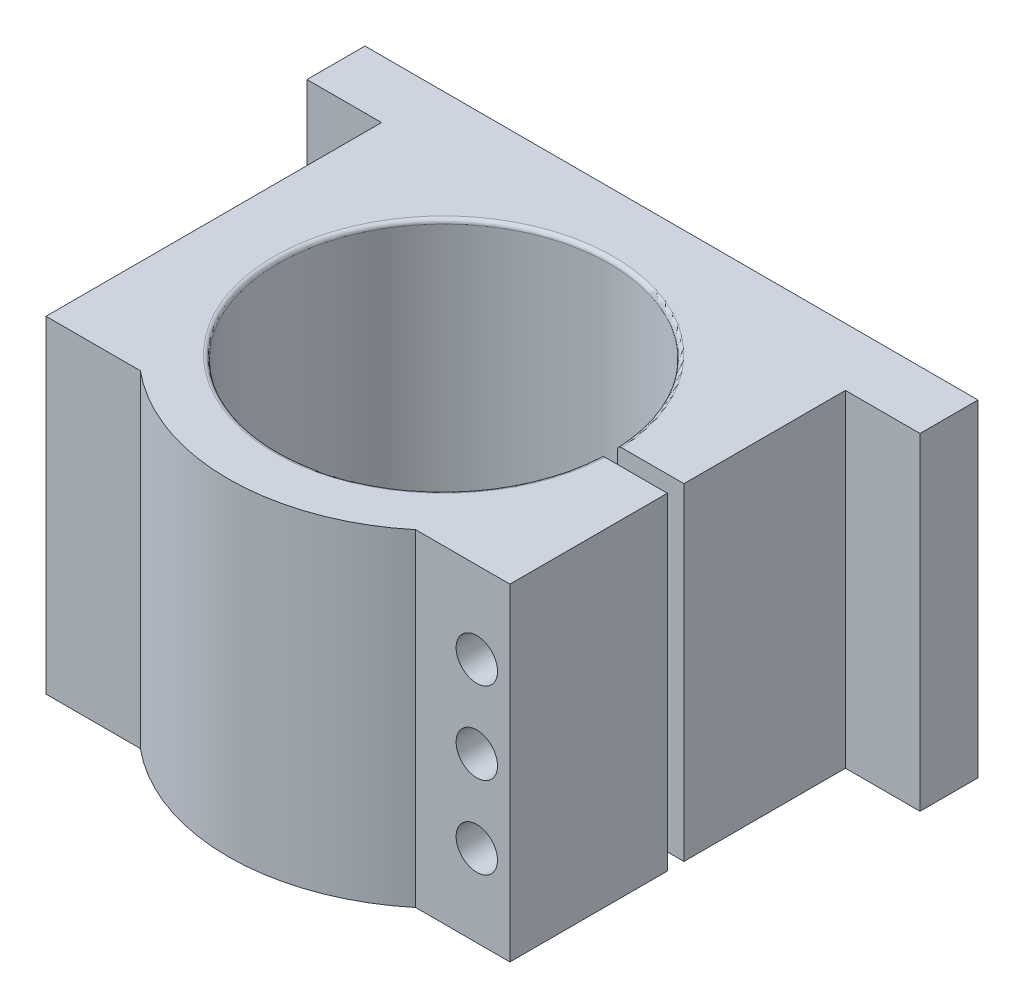
ISO-10303-21;
HEADER;
FILE_DESCRIPTION(('STEP AP214'),'2;1');
FILE_NAME('part.step','',(''),(''),'','','');
FILE_SCHEMA(('AUTOMOTIVE_DESIGN { 1 0 10303 214 1 1 1 1 }'));
ENDSEC;
DATA;
#1=APPLICATION_CONTEXT('core data for automotive mechanical design processes');
#2=APPLICATION_PROTOCOL_DEFINITION('international standard','automotive_design',2000,#1);
#3=PRODUCT_CONTEXT('',#1,'mechanical');
#4=PRODUCT('Part','Part','',(#3));
#5=PRODUCT_RELATED_PRODUCT_CATEGORY('part','',(#4));
#6=PRODUCT_DEFINITION_FORMATION('','',#4);
#7=PRODUCT_DEFINITION_CONTEXT('part definition',#1,'design');
#8=PRODUCT_DEFINITION('design','',#6,#7);
#9=PRODUCT_DEFINITION_SHAPE('','',#8);
#10=(LENGTH_UNIT() NAMED_UNIT(*) SI_UNIT(.MILLI.,.METRE.));
#11=(NAMED_UNIT(*) PLANE_ANGLE_UNIT() SI_UNIT($,.RADIAN.));
#12=(NAMED_UNIT(*) SI_UNIT($,.STERADIAN.) SOLID_ANGLE_UNIT());
#13=UNCERTAINTY_MEASURE_WITH_UNIT(LENGTH_MEASURE(1.E-05),#10,'distance_accuracy_value','');
#14=(GEOMETRIC_REPRESENTATION_CONTEXT(3) GLOBAL_UNCERTAINTY_ASSIGNED_CONTEXT((#13)) GLOBAL_UNIT_ASSIGNED_CONTEXT((#10,
#11,#12)) REPRESENTATION_CONTEXT('',''));
#15=CARTESIAN_POINT('',(0.,0.,0.));
#16=DIRECTION('',(0.,0.,1.));
#17=DIRECTION('',(1.,0.,0.));
#18=AXIS2_PLACEMENT_3D('',#15,#16,#17);
#19=CARTESIAN_POINT('',(48.,-19.75,35.));
#20=DIRECTION('',(0.,0.,1.));
#21=DIRECTION('',(1.,0.,0.));
#22=AXIS2_PLACEMENT_3D('',#19,#20,#21);
#23=CYLINDRICAL_SURFACE('',#22,3.);
#24=CARTESIAN_POINT('',(48.,-19.75,57.));
#25=DIRECTION('',(0.,0.,1.));
#26=DIRECTION('',(1.,0.,0.));
#27=AXIS2_PLACEMENT_3D('',#24,#25,#26);
#28=CIRCLE('',#27,3.);
#29=CARTESIAN_POINT('',(51.,-19.75,57.));
#30=VERTEX_POINT('',#29);
#31=EDGE_CURVE('E359',#30,#30,#28,.T.);
#32=ORIENTED_EDGE('',*,*,#31,.F.);
#33=EDGE_LOOP('',(#32));
#34=FACE_BOUND('',#33,.T.);
#35=CARTESIAN_POINT('',(48.,-19.75,85.));
#36=DIRECTION('',(0.,0.,1.));
#37=DIRECTION('',(1.,0.,0.));
#38=AXIS2_PLACEMENT_3D('',#35,#36,#37);
#39=CIRCLE('',#38,3.);
#40=CARTESIAN_POINT('',(51.,-19.75,85.));
#41=VERTEX_POINT('',#40);
#42=EDGE_CURVE('E238',#41,#41,#39,.F.);
#43=ORIENTED_EDGE('',*,*,#42,.F.);
#44=EDGE_LOOP('',(#43));
#45=FACE_BOUND('',#44,.T.);
#46=ADVANCED_FACE('F57',(#34,#45),#23,.F.);
#47=CARTESIAN_POINT('',(48.,0.,35.));
#48=DIRECTION('',(0.,0.,1.));
#49=DIRECTION('',(1.,0.,0.));
#50=AXIS2_PLACEMENT_3D('',#47,#48,#49);
#51=CYLINDRICAL_SURFACE('',#50,3.);
#52=CARTESIAN_POINT('',(48.,0.,57.));
#53=DIRECTION('',(0.,0.,1.));
#54=DIRECTION('',(1.,0.,0.));
#55=AXIS2_PLACEMENT_3D('',#52,#53,#54);
#56=CIRCLE('',#55,3.);
#57=CARTESIAN_POINT('',(51.,0.,57.));
#58=VERTEX_POINT('',#57);
#59=EDGE_CURVE('E362',#58,#58,#56,.T.);
#60=ORIENTED_EDGE('',*,*,#59,.F.);
#61=EDGE_LOOP('',(#60));
#62=FACE_BOUND('',#61,.T.);
#63=CARTESIAN_POINT('',(48.,0.,85.));
#64=DIRECTION('',(0.,0.,1.));
#65=DIRECTION('',(1.,0.,0.));
#66=AXIS2_PLACEMENT_3D('',#63,#64,#65);
#67=CIRCLE('',#66,3.);
#68=CARTESIAN_POINT('',(51.,0.,85.));
#69=VERTEX_POINT('',#68);
#70=EDGE_CURVE('E502',#69,#69,#67,.F.);
#71=ORIENTED_EDGE('',*,*,#70,.F.);
#72=EDGE_LOOP('',(#71));
#73=FACE_BOUND('',#72,.T.);
#74=ADVANCED_FACE('F325',(#62,#73),#51,.F.);
#75=CARTESIAN_POINT('',(48.,19.75,35.));
#76=DIRECTION('',(0.,0.,1.));
#77=DIRECTION('',(1.,0.,0.));
#78=AXIS2_PLACEMENT_3D('',#75,#76,#77);
#79=CYLINDRICAL_SURFACE('',#78,3.);
#80=CARTESIAN_POINT('',(48.,19.75,57.));
#81=DIRECTION('',(0.,0.,1.));
#82=DIRECTION('',(1.,0.,0.));
#83=AXIS2_PLACEMENT_3D('',#80,#81,#82);
#84=CIRCLE('',#83,3.);
#85=CARTESIAN_POINT('',(51.,19.75,57.));
#86=VERTEX_POINT('',#85);
#87=EDGE_CURVE('E202',#86,#86,#84,.T.);
#88=ORIENTED_EDGE('',*,*,#87,.F.);
#89=EDGE_LOOP('',(#88));
#90=FACE_BOUND('',#89,.T.);
#91=CARTESIAN_POINT('',(48.,19.75,85.));
#92=DIRECTION('',(0.,0.,1.));
#93=DIRECTION('',(1.,0.,0.));
#94=AXIS2_PLACEMENT_3D('',#91,#92,#93);
#95=CIRCLE('',#94,3.);
#96=CARTESIAN_POINT('',(51.,19.75,85.));
#97=VERTEX_POINT('',#96);
#98=EDGE_CURVE('E504',#97,#97,#95,.F.);
#99=ORIENTED_EDGE('',*,*,#98,.F.);
#100=EDGE_LOOP('',(#99));
#101=FACE_BOUND('',#100,.T.);
#102=ADVANCED_FACE('F332',(#90,#101),#79,.F.);
#103=CARTESIAN_POINT('',(56.,-39.5,107.));
#104=DIRECTION('',(-1.,0.,0.));
#105=DIRECTION('',(0.,0.,1.));
#106=AXIS2_PLACEMENT_3D('',#103,#104,#105);
#107=PLANE('',#106);
#108=DIRECTION('',(0.,0.,-1.));
#109=VECTOR('',#108,1.);
#110=CARTESIAN_POINT('',(56.,-39.5,107.));
#111=LINE('',#110,#109);
#112=CARTESIAN_POINT('',(56.,-39.5,95.));
#113=VERTEX_POINT('',#112);
#114=CARTESIAN_POINT('',(56.,-39.5,57.));
#115=VERTEX_POINT('',#114);
#116=EDGE_CURVE('E214',#113,#115,#111,.T.);
#117=ORIENTED_EDGE('',*,*,#116,.T.);
#118=DIRECTION('',(0.,1.,0.));
#119=VECTOR('',#118,1.);
#120=CARTESIAN_POINT('',(56.,-40.5,57.));
#121=LINE('',#120,#119);
#122=CARTESIAN_POINT('',(56.,39.5,57.));
#123=VERTEX_POINT('',#122);
#124=EDGE_CURVE('E178',#115,#123,#121,.T.);
#125=ORIENTED_EDGE('',*,*,#124,.T.);
#126=DIRECTION('',(0.,0.,-1.));
#127=VECTOR('',#126,1.);
#128=CARTESIAN_POINT('',(56.,39.5,107.));
#129=LINE('',#128,#127);
#130=CARTESIAN_POINT('',(56.,39.5,95.));
#131=VERTEX_POINT('',#130);
#132=EDGE_CURVE('E190',#131,#123,#129,.T.);
#133=ORIENTED_EDGE('',*,*,#132,.F.);
#134=DIRECTION('',(0.,1.,0.));
#135=VECTOR('',#134,1.);
#136=CARTESIAN_POINT('',(56.,-39.5,95.));
#137=LINE('',#136,#135);
#138=EDGE_CURVE('E218',#113,#131,#137,.T.);
#139=ORIENTED_EDGE('',*,*,#138,.F.);
#140=EDGE_LOOP('',(#117,#125,#133,#139));
#141=FACE_BOUND('',#140,.T.);
#142=ADVANCED_FACE('F293',(#141),#107,.F.);
#143=CARTESIAN_POINT('',(-74.,39.5,14.));
#144=DIRECTION('',(0.,-1.,0.));
#145=DIRECTION('',(0.,0.,-1.));
#146=AXIS2_PLACEMENT_3D('',#143,#144,#145);
#147=PLANE('',#146);
#148=DIRECTION('',(1.,0.,0.));
#149=VECTOR('',#148,1.);
#150=CARTESIAN_POINT('',(38.2210261738615,39.5,57.));
#151=LINE('',#150,#149);
#152=CARTESIAN_POINT('',(40.9511904588865,39.5,57.));
#153=VERTEX_POINT('',#152);
#154=EDGE_CURVE('E179',#153,#123,#151,.T.);
#155=ORIENTED_EDGE('',*,*,#154,.F.);
#156=CARTESIAN_POINT('',(0.,39.5,55.));
#157=DIRECTION('',(0.,-1.,0.));
#158=DIRECTION('',(0.,0.,-1.));
#159=AXIS2_PLACEMENT_3D('',#156,#157,#158);
#160=CIRCLE('',#159,41.);
#161=CARTESIAN_POINT('',(40.9511904588865,39.5,53.));
#162=VERTEX_POINT('',#161);
#163=EDGE_CURVE('E12',#153,#162,#160,.T.);
#164=ORIENTED_EDGE('',*,*,#163,.T.);
#165=DIRECTION('',(-1.,0.,0.));
#166=VECTOR('',#165,1.);
#167=CARTESIAN_POINT('',(56.,39.5,53.));
#168=LINE('',#167,#166);
#169=CARTESIAN_POINT('',(56.,39.5,53.));
#170=VERTEX_POINT('',#169);
#171=EDGE_CURVE('E172',#170,#162,#168,.T.);
#172=ORIENTED_EDGE('',*,*,#171,.F.);
#173=CARTESIAN_POINT('',(56.,39.5,14.));
#174=VERTEX_POINT('',#173);
#175=EDGE_CURVE('E182',#170,#174,#129,.T.);
#176=ORIENTED_EDGE('',*,*,#175,.T.);
#177=DIRECTION('',(-1.,0.,0.));
#178=VECTOR('',#177,1.);
#179=CARTESIAN_POINT('',(-74.,39.5,14.));
#180=LINE('',#179,#178);
#181=CARTESIAN_POINT('',(74.,39.5,14.));
#182=VERTEX_POINT('',#181);
#183=EDGE_CURVE('E446',#182,#174,#180,.T.);
#184=ORIENTED_EDGE('',*,*,#183,.F.);
#185=DIRECTION('',(0.,0.,-1.));
#186=VECTOR('',#185,1.);
#187=CARTESIAN_POINT('',(74.,39.5,14.));
#188=LINE('',#187,#186);
#189=CARTESIAN_POINT('',(74.,39.5,0.));
#190=VERTEX_POINT('',#189);
#191=EDGE_CURVE('E221',#182,#190,#188,.T.);
#192=ORIENTED_EDGE('',*,*,#191,.T.);
#193=DIRECTION('',(-1.,0.,0.));
#194=VECTOR('',#193,1.);
#195=CARTESIAN_POINT('',(-74.,39.5,0.));
#196=LINE('',#195,#194);
#197=CARTESIAN_POINT('',(-74.,39.5,0.));
#198=VERTEX_POINT('',#197);
#199=EDGE_CURVE('E420',#190,#198,#196,.T.);
#200=ORIENTED_EDGE('',*,*,#199,.T.);
#201=DIRECTION('',(0.,0.,-1.));
#202=VECTOR('',#201,1.);
#203=CARTESIAN_POINT('',(-74.,39.5,14.));
#204=LINE('',#203,#202);
#205=CARTESIAN_POINT('',(-74.,39.5,14.));
#206=VERTEX_POINT('',#205);
#207=EDGE_CURVE('E441',#206,#198,#204,.T.);
#208=ORIENTED_EDGE('',*,*,#207,.F.);
#209=CARTESIAN_POINT('',(-56.,39.5,14.));
#210=VERTEX_POINT('',#209);
#211=EDGE_CURVE('E450',#210,#206,#180,.T.);
#212=ORIENTED_EDGE('',*,*,#211,.F.);
#213=DIRECTION('',(0.,0.,-1.));
#214=VECTOR('',#213,1.);
#215=CARTESIAN_POINT('',(-56.,39.5,107.));
#216=LINE('',#215,#214);
#217=CARTESIAN_POINT('',(-56.,39.5,95.));
#218=VERTEX_POINT('',#217);
#219=EDGE_CURVE('E191',#218,#210,#216,.T.);
#220=ORIENTED_EDGE('',*,*,#219,.F.);
#221=DIRECTION('',(-1.,0.,0.));
#222=VECTOR('',#221,1.);
#223=CARTESIAN_POINT('',(0.,39.5,95.));
#224=LINE('',#223,#222);
#225=CARTESIAN_POINT('',(-33.2264954516723,39.5,95.));
#226=VERTEX_POINT('',#225);
#227=EDGE_CURVE('E394',#226,#218,#224,.T.);
#228=ORIENTED_EDGE('',*,*,#227,.F.);
#229=CARTESIAN_POINT('',(0.,39.5,55.));
#230=DIRECTION('',(0.,1.,0.));
#231=DIRECTION('',(0.,0.,1.));
#232=AXIS2_PLACEMENT_3D('',#229,#230,#231);
#233=CIRCLE('',#232,52.);
#234=CARTESIAN_POINT('',(33.2264954516723,39.5,95.));
#235=VERTEX_POINT('',#234);
#236=EDGE_CURVE('E391',#235,#226,#233,.F.);
#237=ORIENTED_EDGE('',*,*,#236,.F.);
#238=DIRECTION('',(1.,0.,0.));
#239=VECTOR('',#238,1.);
#240=CARTESIAN_POINT('',(0.,39.5,95.));
#241=LINE('',#240,#239);
#242=EDGE_CURVE('E383',#235,#131,#241,.T.);
#243=ORIENTED_EDGE('',*,*,#242,.T.);
#244=ORIENTED_EDGE('',*,*,#132,.T.);
#245=EDGE_LOOP('',(#155,#164,#172,#176,#184,#192,#200,#208,#212,#220,#228,#237,#243,#244));
#246=FACE_BOUND('',#245,.T.);
#247=ADVANCED_FACE('F181',(#246),#147,.F.);
#248=CARTESIAN_POINT('',(-74.,-39.5,14.));
#249=DIRECTION('',(0.,1.,0.));
#250=DIRECTION('',(0.,0.,1.));
#251=AXIS2_PLACEMENT_3D('',#248,#249,#250);
#252=PLANE('',#251);
#253=DIRECTION('',(-1.,0.,0.));
#254=VECTOR('',#253,1.);
#255=CARTESIAN_POINT('',(-74.,-39.5,53.));
#256=LINE('',#255,#254);
#257=CARTESIAN_POINT('',(56.,-39.5,53.));
#258=VERTEX_POINT('',#257);
#259=CARTESIAN_POINT('',(40.9511904588865,-39.5,53.));
#260=VERTEX_POINT('',#259);
#261=EDGE_CURVE('E174',#258,#260,#256,.T.);
#262=ORIENTED_EDGE('',*,*,#261,.T.);
#263=CARTESIAN_POINT('',(0.,-39.5,55.));
#264=DIRECTION('',(0.,1.,0.));
#265=DIRECTION('',(0.,0.,1.));
#266=AXIS2_PLACEMENT_3D('',#263,#264,#265);
#267=CIRCLE('',#266,41.);
#268=CARTESIAN_POINT('',(40.9511904588865,-39.5,57.));
#269=VERTEX_POINT('',#268);
#270=EDGE_CURVE('E224',#260,#269,#267,.T.);
#271=ORIENTED_EDGE('',*,*,#270,.T.);
#272=DIRECTION('',(1.,0.,0.));
#273=VECTOR('',#272,1.);
#274=CARTESIAN_POINT('',(-74.,-39.5,57.));
#275=LINE('',#274,#273);
#276=EDGE_CURVE('E381',#269,#115,#275,.T.);
#277=ORIENTED_EDGE('',*,*,#276,.T.);
#278=ORIENTED_EDGE('',*,*,#116,.F.);
#279=DIRECTION('',(1.,0.,0.));
#280=VECTOR('',#279,1.);
#281=CARTESIAN_POINT('',(-74.0000000000001,-39.5,94.9999999999999));
#282=LINE('',#281,#280);
#283=CARTESIAN_POINT('',(33.2264954516723,-39.5,95.));
#284=VERTEX_POINT('',#283);
#285=EDGE_CURVE('E387',#284,#113,#282,.T.);
#286=ORIENTED_EDGE('',*,*,#285,.F.);
#287=CARTESIAN_POINT('',(0.,-39.5,55.));
#288=DIRECTION('',(0.,1.,0.));
#289=DIRECTION('',(0.,0.,1.));
#290=AXIS2_PLACEMENT_3D('',#287,#288,#289);
#291=CIRCLE('',#290,52.);
#292=CARTESIAN_POINT('',(-33.2264954516723,-39.5,95.));
#293=VERTEX_POINT('',#292);
#294=EDGE_CURVE('E400',#284,#293,#291,.F.);
#295=ORIENTED_EDGE('',*,*,#294,.T.);
#296=DIRECTION('',(-1.,0.,0.));
#297=VECTOR('',#296,1.);
#298=CARTESIAN_POINT('',(-74.,-39.5,95.));
#299=LINE('',#298,#297);
#300=CARTESIAN_POINT('',(-56.,-39.5,95.));
#301=VERTEX_POINT('',#300);
#302=EDGE_CURVE('E404',#293,#301,#299,.T.);
#303=ORIENTED_EDGE('',*,*,#302,.T.);
#304=DIRECTION('',(0.,0.,-1.));
#305=VECTOR('',#304,1.);
#306=CARTESIAN_POINT('',(-56.,-39.5,107.));
#307=LINE('',#306,#305);
#308=CARTESIAN_POINT('',(-56.,-39.5,14.));
#309=VERTEX_POINT('',#308);
#310=EDGE_CURVE('E217',#301,#309,#307,.T.);
#311=ORIENTED_EDGE('',*,*,#310,.T.);
#312=DIRECTION('',(1.,0.,0.));
#313=VECTOR('',#312,1.);
#314=CARTESIAN_POINT('',(-74.,-39.5,14.));
#315=LINE('',#314,#313);
#316=CARTESIAN_POINT('',(-74.,-39.5,14.));
#317=VERTEX_POINT('',#316);
#318=EDGE_CURVE('E438',#317,#309,#315,.T.);
#319=ORIENTED_EDGE('',*,*,#318,.F.);
#320=DIRECTION('',(0.,0.,-1.));
#321=VECTOR('',#320,1.);
#322=CARTESIAN_POINT('',(-74.,-39.5,14.));
#323=LINE('',#322,#321);
#324=CARTESIAN_POINT('',(-74.,-39.5,0.));
#325=VERTEX_POINT('',#324);
#326=EDGE_CURVE('E437',#317,#325,#323,.T.);
#327=ORIENTED_EDGE('',*,*,#326,.T.);
#328=DIRECTION('',(1.,0.,0.));
#329=VECTOR('',#328,1.);
#330=CARTESIAN_POINT('',(-74.,-39.5,0.));
#331=LINE('',#330,#329);
#332=CARTESIAN_POINT('',(74.,-39.5,0.));
#333=VERTEX_POINT('',#332);
#334=EDGE_CURVE('E432',#325,#333,#331,.T.);
#335=ORIENTED_EDGE('',*,*,#334,.T.);
#336=DIRECTION('',(0.,0.,-1.));
#337=VECTOR('',#336,1.);
#338=CARTESIAN_POINT('',(74.,-39.5,14.));
#339=LINE('',#338,#337);
#340=CARTESIAN_POINT('',(74.,-39.5,14.));
#341=VERTEX_POINT('',#340);
#342=EDGE_CURVE('E435',#341,#333,#339,.T.);
#343=ORIENTED_EDGE('',*,*,#342,.F.);
#344=CARTESIAN_POINT('',(56.,-39.5,14.));
#345=VERTEX_POINT('',#344);
#346=EDGE_CURVE('E454',#345,#341,#315,.T.);
#347=ORIENTED_EDGE('',*,*,#346,.F.);
#348=EDGE_CURVE('E194',#258,#345,#111,.T.);
#349=ORIENTED_EDGE('',*,*,#348,.F.);
#350=EDGE_LOOP('',(#262,#271,#277,#278,#286,#295,#303,#311,#319,#327,#335,#343,#347,#349));
#351=FACE_BOUND('',#350,.T.);
#352=ADVANCED_FACE('F292',(#351),#252,.F.);
#353=ORIENTED_EDGE('',*,*,#175,.F.);
#354=DIRECTION('',(0.,1.,0.));
#355=VECTOR('',#354,1.);
#356=CARTESIAN_POINT('',(56.,-40.5,53.));
#357=LINE('',#356,#355);
#358=EDGE_CURVE('E170',#258,#170,#357,.T.);
#359=ORIENTED_EDGE('',*,*,#358,.F.);
#360=ORIENTED_EDGE('',*,*,#348,.T.);
#361=DIRECTION('',(0.,1.,0.));
#362=VECTOR('',#361,1.);
#363=CARTESIAN_POINT('',(56.,-39.5,14.));
#364=LINE('',#363,#362);
#365=EDGE_CURVE('E189',#345,#174,#364,.T.);
#366=ORIENTED_EDGE('',*,*,#365,.T.);
#367=EDGE_LOOP('',(#353,#359,#360,#366));
#368=FACE_BOUND('',#367,.T.);
#369=ADVANCED_FACE('F187',(#368),#107,.F.);
#370=CARTESIAN_POINT('',(0.,0.,14.));
#371=DIRECTION('',(0.,0.,-1.));
#372=DIRECTION('',(-1.,0.,0.));
#373=AXIS2_PLACEMENT_3D('',#370,#371,#372);
#374=PLANE('',#373);
#375=DIRECTION('',(0.,-1.,0.));
#376=VECTOR('',#375,1.);
#377=CARTESIAN_POINT('',(-56.,-39.5,14.));
#378=LINE('',#377,#376);
#379=EDGE_CURVE('E407',#210,#309,#378,.T.);
#380=ORIENTED_EDGE('',*,*,#379,.F.);
#381=ORIENTED_EDGE('',*,*,#211,.T.);
#382=DIRECTION('',(0.,-1.,0.));
#383=VECTOR('',#382,1.);
#384=CARTESIAN_POINT('',(-74.,-39.5,14.));
#385=LINE('',#384,#383);
#386=EDGE_CURVE('E449',#206,#317,#385,.T.);
#387=ORIENTED_EDGE('',*,*,#386,.T.);
#388=ORIENTED_EDGE('',*,*,#318,.T.);
#389=EDGE_LOOP('',(#380,#381,#387,#388));
#390=FACE_BOUND('',#389,.T.);
#391=ADVANCED_FACE('F304',(#390),#374,.F.);
#392=ORIENTED_EDGE('',*,*,#365,.F.);
#393=ORIENTED_EDGE('',*,*,#346,.T.);
#394=DIRECTION('',(0.,1.,0.));
#395=VECTOR('',#394,1.);
#396=CARTESIAN_POINT('',(74.,-39.5,14.));
#397=LINE('',#396,#395);
#398=EDGE_CURVE('E434',#341,#182,#397,.T.);
#399=ORIENTED_EDGE('',*,*,#398,.T.);
#400=ORIENTED_EDGE('',*,*,#183,.T.);
#401=EDGE_LOOP('',(#392,#393,#399,#400));
#402=FACE_BOUND('',#401,.T.);
#403=ADVANCED_FACE('F288',(#402),#374,.F.);
#404=CARTESIAN_POINT('',(74.,-39.5,14.));
#405=DIRECTION('',(-1.,0.,0.));
#406=DIRECTION('',(0.,0.,1.));
#407=AXIS2_PLACEMENT_3D('',#404,#405,#406);
#408=PLANE('',#407);
#409=DIRECTION('',(0.,1.,0.));
#410=VECTOR('',#409,1.);
#411=CARTESIAN_POINT('',(74.,-39.5,0.));
#412=LINE('',#411,#410);
#413=EDGE_CURVE('E415',#333,#190,#412,.T.);
#414=ORIENTED_EDGE('',*,*,#413,.T.);
#415=ORIENTED_EDGE('',*,*,#191,.F.);
#416=ORIENTED_EDGE('',*,*,#398,.F.);
#417=ORIENTED_EDGE('',*,*,#342,.T.);
#418=EDGE_LOOP('',(#414,#415,#416,#417));
#419=FACE_BOUND('',#418,.T.);
#420=ADVANCED_FACE('F283',(#419),#408,.F.);
#421=CARTESIAN_POINT('',(-74.,-39.5,14.));
#422=DIRECTION('',(1.,0.,0.));
#423=DIRECTION('',(0.,0.,-1.));
#424=AXIS2_PLACEMENT_3D('',#421,#422,#423);
#425=PLANE('',#424);
#426=DIRECTION('',(0.,-1.,0.));
#427=VECTOR('',#426,1.);
#428=CARTESIAN_POINT('',(-74.,-39.5,0.));
#429=LINE('',#428,#427);
#430=EDGE_CURVE('E425',#198,#325,#429,.T.);
#431=ORIENTED_EDGE('',*,*,#430,.T.);
#432=ORIENTED_EDGE('',*,*,#326,.F.);
#433=ORIENTED_EDGE('',*,*,#386,.F.);
#434=ORIENTED_EDGE('',*,*,#207,.T.);
#435=EDGE_LOOP('',(#431,#432,#433,#434));
#436=FACE_BOUND('',#435,.T.);
#437=ADVANCED_FACE('F287',(#436),#425,.F.);
#438=CARTESIAN_POINT('',(0.,0.,0.));
#439=DIRECTION('',(0.,0.,-1.));
#440=DIRECTION('',(-1.,0.,0.));
#441=AXIS2_PLACEMENT_3D('',#438,#439,#440);
#442=PLANE('',#441);
#443=ORIENTED_EDGE('',*,*,#413,.F.);
#444=ORIENTED_EDGE('',*,*,#334,.F.);
#445=ORIENTED_EDGE('',*,*,#430,.F.);
#446=ORIENTED_EDGE('',*,*,#199,.F.);
#447=EDGE_LOOP('',(#443,#444,#445,#446));
#448=FACE_BOUND('',#447,.T.);
#449=ADVANCED_FACE('F296',(#448),#442,.T.);
#450=CARTESIAN_POINT('',(-56.,-39.5,107.));
#451=DIRECTION('',(1.,0.,0.));
#452=DIRECTION('',(0.,0.,-1.));
#453=AXIS2_PLACEMENT_3D('',#450,#451,#452);
#454=PLANE('',#453);
#455=ORIENTED_EDGE('',*,*,#310,.F.);
#456=DIRECTION('',(0.,1.,0.));
#457=VECTOR('',#456,1.);
#458=CARTESIAN_POINT('',(-56.,-40.5,95.));
#459=LINE('',#458,#457);
#460=EDGE_CURVE('E397',#301,#218,#459,.T.);
#461=ORIENTED_EDGE('',*,*,#460,.T.);
#462=ORIENTED_EDGE('',*,*,#219,.T.);
#463=ORIENTED_EDGE('',*,*,#379,.T.);
#464=EDGE_LOOP('',(#455,#461,#462,#463));
#465=FACE_BOUND('',#464,.T.);
#466=ADVANCED_FACE('F302',(#465),#454,.F.);
#467=CARTESIAN_POINT('',(0.,-40.5,55.));
#468=DIRECTION('',(0.,1.,0.));
#469=DIRECTION('',(0.,0.,1.));
#470=AXIS2_PLACEMENT_3D('',#467,#468,#469);
#471=CYLINDRICAL_SURFACE('',#470,40.);
#472=DIRECTION('',(0.,1.,0.));
#473=VECTOR('',#472,1.);
#474=CARTESIAN_POINT('',(39.9499687108763,-40.5,57.));
#475=LINE('',#474,#473);
#476=CARTESIAN_POINT('',(39.9499687108763,38.5,57.));
#477=VERTEX_POINT('',#476);
#478=CARTESIAN_POINT('',(39.9499687108763,-38.5,57.));
#479=VERTEX_POINT('',#478);
#480=EDGE_CURVE('E222',#477,#479,#475,.F.);
#481=ORIENTED_EDGE('',*,*,#480,.T.);
#482=CARTESIAN_POINT('',(0.,-38.5,55.));
#483=DIRECTION('',(0.,1.,0.));
#484=DIRECTION('',(0.,0.,1.));
#485=AXIS2_PLACEMENT_3D('',#482,#483,#484);
#486=CIRCLE('',#485,40.);
#487=CARTESIAN_POINT('',(39.9499687108763,-38.5,53.));
#488=VERTEX_POINT('',#487);
#489=EDGE_CURVE('E470',#479,#488,#486,.F.);
#490=ORIENTED_EDGE('',*,*,#489,.T.);
#491=DIRECTION('',(0.,1.,0.));
#492=VECTOR('',#491,1.);
#493=CARTESIAN_POINT('',(39.9499687108763,-40.5,53.));
#494=LINE('',#493,#492);
#495=CARTESIAN_POINT('',(39.9499687108763,38.5,53.));
#496=VERTEX_POINT('',#495);
#497=EDGE_CURVE('E220',#488,#496,#494,.T.);
#498=ORIENTED_EDGE('',*,*,#497,.T.);
#499=CARTESIAN_POINT('',(0.,38.5,55.));
#500=DIRECTION('',(0.,-1.,0.));
#501=DIRECTION('',(0.,0.,-1.));
#502=AXIS2_PLACEMENT_3D('',#499,#500,#501);
#503=CIRCLE('',#502,40.);
#504=EDGE_CURVE('E472',#496,#477,#503,.F.);
#505=ORIENTED_EDGE('',*,*,#504,.T.);
#506=EDGE_LOOP('',(#481,#490,#498,#505));
#507=FACE_BOUND('',#506,.T.);
#508=ADVANCED_FACE('F310',(#507),#471,.F.);
#509=CARTESIAN_POINT('',(0.,-40.5,95.));
#510=DIRECTION('',(0.,0.,-1.));
#511=DIRECTION('',(-1.,0.,0.));
#512=AXIS2_PLACEMENT_3D('',#509,#510,#511);
#513=PLANE('',#512);
#514=DIRECTION('',(0.,1.,0.));
#515=VECTOR('',#514,1.);
#516=CARTESIAN_POINT('',(-33.2264954516723,-40.5,95.));
#517=LINE('',#516,#515);
#518=EDGE_CURVE('E396',#293,#226,#517,.T.);
#519=ORIENTED_EDGE('',*,*,#518,.T.);
#520=ORIENTED_EDGE('',*,*,#227,.T.);
#521=ORIENTED_EDGE('',*,*,#460,.F.);
#522=ORIENTED_EDGE('',*,*,#302,.F.);
#523=EDGE_LOOP('',(#519,#520,#521,#522));
#524=FACE_BOUND('',#523,.T.);
#525=ADVANCED_FACE('F316',(#524),#513,.F.);
#526=CARTESIAN_POINT('',(0.,-40.5,55.));
#527=DIRECTION('',(0.,1.,0.));
#528=DIRECTION('',(0.,0.,1.));
#529=AXIS2_PLACEMENT_3D('',#526,#527,#528);
#530=CYLINDRICAL_SURFACE('',#529,52.);
#531=ORIENTED_EDGE('',*,*,#294,.F.);
#532=DIRECTION('',(0.,1.,0.));
#533=VECTOR('',#532,1.);
#534=CARTESIAN_POINT('',(33.2264954516723,-40.5,95.));
#535=LINE('',#534,#533);
#536=EDGE_CURVE('E384',#284,#235,#535,.T.);
#537=ORIENTED_EDGE('',*,*,#536,.T.);
#538=ORIENTED_EDGE('',*,*,#236,.T.);
#539=ORIENTED_EDGE('',*,*,#518,.F.);
#540=EDGE_LOOP('',(#531,#537,#538,#539));
#541=FACE_BOUND('',#540,.T.);
#542=ADVANCED_FACE('F317',(#541),#530,.T.);
#543=CARTESIAN_POINT('',(0.,-40.5,95.));
#544=DIRECTION('',(0.,0.,1.));
#545=DIRECTION('',(1.,0.,0.));
#546=AXIS2_PLACEMENT_3D('',#543,#544,#545);
#547=PLANE('',#546);
#548=CARTESIAN_POINT('',(48.,-19.75,95.));
#549=DIRECTION('',(0.,0.,1.));
#550=DIRECTION('',(1.,0.,0.));
#551=AXIS2_PLACEMENT_3D('',#548,#549,#550);
#552=CIRCLE('',#551,5.);
#553=CARTESIAN_POINT('',(53.,-19.75,95.));
#554=VERTEX_POINT('',#553);
#555=EDGE_CURVE('E492',#554,#554,#552,.T.);
#556=ORIENTED_EDGE('',*,*,#555,.F.);
#557=EDGE_LOOP('',(#556));
#558=FACE_BOUND('',#557,.T.);
#559=CARTESIAN_POINT('',(48.,0.,95.));
#560=DIRECTION('',(0.,0.,1.));
#561=DIRECTION('',(1.,0.,0.));
#562=AXIS2_PLACEMENT_3D('',#559,#560,#561);
#563=CIRCLE('',#562,5.);
#564=CARTESIAN_POINT('',(53.,0.,95.));
#565=VERTEX_POINT('',#564);
#566=EDGE_CURVE('E496',#565,#565,#563,.T.);
#567=ORIENTED_EDGE('',*,*,#566,.F.);
#568=EDGE_LOOP('',(#567));
#569=FACE_BOUND('',#568,.T.);
#570=CARTESIAN_POINT('',(48.,19.75,95.));
#571=DIRECTION('',(0.,0.,1.));
#572=DIRECTION('',(1.,0.,0.));
#573=AXIS2_PLACEMENT_3D('',#570,#571,#572);
#574=CIRCLE('',#573,5.);
#575=CARTESIAN_POINT('',(53.,19.75,95.));
#576=VERTEX_POINT('',#575);
#577=EDGE_CURVE('E499',#576,#576,#574,.T.);
#578=ORIENTED_EDGE('',*,*,#577,.F.);
#579=EDGE_LOOP('',(#578));
#580=FACE_BOUND('',#579,.T.);
#581=ORIENTED_EDGE('',*,*,#285,.T.);
#582=ORIENTED_EDGE('',*,*,#138,.T.);
#583=ORIENTED_EDGE('',*,*,#242,.F.);
#584=ORIENTED_EDGE('',*,*,#536,.F.);
#585=EDGE_LOOP('',(#581,#582,#583,#584));
#586=FACE_BOUND('',#585,.T.);
#587=ADVANCED_FACE('F263',(#558,#569,#580,#586),#547,.T.);
#588=CARTESIAN_POINT('',(56.,-40.5,53.));
#589=DIRECTION('',(0.,0.,-1.));
#590=DIRECTION('',(-1.,0.,0.));
#591=AXIS2_PLACEMENT_3D('',#588,#589,#590);
#592=PLANE('',#591);
#593=CARTESIAN_POINT('',(48.,-19.75,53.));
#594=DIRECTION('',(0.,0.,-1.));
#595=DIRECTION('',(-1.,0.,0.));
#596=AXIS2_PLACEMENT_3D('',#593,#594,#595);
#597=CIRCLE('',#596,3.);
#598=CARTESIAN_POINT('',(45.,-19.75,53.));
#599=VERTEX_POINT('',#598);
#600=EDGE_CURVE('E357',#599,#599,#597,.T.);
#601=ORIENTED_EDGE('',*,*,#600,.T.);
#602=EDGE_LOOP('',(#601));
#603=FACE_BOUND('',#602,.T.);
#604=CARTESIAN_POINT('',(48.,0.,53.));
#605=DIRECTION('',(0.,0.,-1.));
#606=DIRECTION('',(-1.,0.,0.));
#607=AXIS2_PLACEMENT_3D('',#604,#605,#606);
#608=CIRCLE('',#607,3.);
#609=CARTESIAN_POINT('',(45.,0.,53.));
#610=VERTEX_POINT('',#609);
#611=EDGE_CURVE('E369',#610,#610,#608,.T.);
#612=ORIENTED_EDGE('',*,*,#611,.T.);
#613=EDGE_LOOP('',(#612));
#614=FACE_BOUND('',#613,.T.);
#615=CARTESIAN_POINT('',(48.,19.75,53.));
#616=DIRECTION('',(0.,0.,-1.));
#617=DIRECTION('',(-1.,0.,0.));
#618=AXIS2_PLACEMENT_3D('',#615,#616,#617);
#619=CIRCLE('',#618,3.);
#620=CARTESIAN_POINT('',(45.,19.75,53.));
#621=VERTEX_POINT('',#620);
#622=EDGE_CURVE('E184',#621,#621,#619,.T.);
#623=ORIENTED_EDGE('',*,*,#622,.T.);
#624=EDGE_LOOP('',(#623));
#625=FACE_BOUND('',#624,.T.);
#626=ORIENTED_EDGE('',*,*,#497,.F.);
#627=CARTESIAN_POINT('',(39.9499687108764,-38.5,53.));
#628=CARTESIAN_POINT('',(39.9499688787471,-38.5281093618348,53.));
#629=CARTESIAN_POINT('',(39.9511561456031,-38.5562052480322,53.));
#630=CARTESIAN_POINT('',(39.9558925065014,-38.6121957700732,53.));
#631=CARTESIAN_POINT('',(39.959441481226,-38.6400904160117,53.));
#632=CARTESIAN_POINT('',(39.9735966762138,-38.723121973056,53.));
#633=CARTESIAN_POINT('',(39.9877112641532,-38.7777023819924,53.));
#634=CARTESIAN_POINT('',(40.0249017513027,-38.883716809563,53.));
#635=CARTESIAN_POINT('',(40.0479818403342,-38.9351493440826,53.));
#636=CARTESIAN_POINT('',(40.1024422217941,-39.0334114786874,53.));
#637=CARTESIAN_POINT('',(40.1338211372301,-39.0802418406269,53.));
#638=CARTESIAN_POINT('',(40.2040055071707,-39.1680000369908,53.));
#639=CARTESIAN_POINT('',(40.242815053912,-39.2089245970588,53.));
#640=CARTESIAN_POINT('',(40.326755838125,-39.2836952994773,53.));
#641=CARTESIAN_POINT('',(40.3718883265139,-39.3175400378599,53.));
#642=CARTESIAN_POINT('',(40.467247294289,-39.3772268447739,53.));
#643=CARTESIAN_POINT('',(40.5174806679697,-39.4030578857403,53.));
#644=CARTESIAN_POINT('',(40.6215582804557,-39.445917124682,53.));
#645=CARTESIAN_POINT('',(40.6754004446582,-39.4629503320976,53.));
#646=CARTESIAN_POINT('',(40.7665028712401,-39.4835408699021,53.));
#647=CARTESIAN_POINT('',(40.803194371653,-39.4897092842501,53.));
#648=CARTESIAN_POINT('',(40.8769823202988,-39.4979383423505,53.));
#649=CARTESIAN_POINT('',(40.9140781201888,-39.5000048013345,53.));
#650=CARTESIAN_POINT('',(40.9511904588865,-39.5,53.));
#651=B_SPLINE_CURVE_WITH_KNOTS('',3,(#627,#628,#629,#630,#631,#632,#633,#634,#635,#636,#637,
#638,#639,#640,#641,#642,#643,#644,#645,#646,#647,#648,#649,#650),.UNSPECIFIED.,.F.,.F.,(4,2,2,
2,2,2,2,2,2,2,2,4),(0.,0.0842762578347381,0.168548258204513,0.336808286317033,0.505147041676647,
0.673457882736356,0.841861684851886,1.01029885078581,1.17896678363245,1.34753857167516,
1.45894395853664,1.57019129586512),.UNSPECIFIED.);
#652=EDGE_CURVE('E66',#488,#260,#651,.T.);
#653=ORIENTED_EDGE('',*,*,#652,.T.);
#654=ORIENTED_EDGE('',*,*,#261,.F.);
#655=ORIENTED_EDGE('',*,*,#358,.T.);
#656=ORIENTED_EDGE('',*,*,#171,.T.);
#657=CARTESIAN_POINT('',(40.9511904588865,39.5,53.));
#658=CARTESIAN_POINT('',(40.9229966648085,39.4999997947674,53.));
#659=CARTESIAN_POINT('',(40.8948163721064,39.4988097576262,53.));
#660=CARTESIAN_POINT('',(40.8386572707954,39.4940621298138,53.));
#661=CARTESIAN_POINT('',(40.8106784530106,39.4905046476626,53.));
#662=CARTESIAN_POINT('',(40.7273918668772,39.4763143404796,53.));
#663=CARTESIAN_POINT('',(40.6726417103401,39.4621635638113,53.));
#664=CARTESIAN_POINT('',(40.5662953240797,39.4248706496816,53.));
#665=CARTESIAN_POINT('',(40.5147006558567,39.4017241016489,53.));
#666=CARTESIAN_POINT('',(40.416134115992,39.3470957957819,53.));
#667=CARTESIAN_POINT('',(40.3691613901817,39.3156155820532,53.));
#668=CARTESIAN_POINT('',(40.2811990353858,39.245227941961,53.));
#669=CARTESIAN_POINT('',(40.2402063183708,39.2063243730866,53.));
#670=CARTESIAN_POINT('',(40.1653343532399,39.1221709071489,53.));
#671=CARTESIAN_POINT('',(40.1314564807593,39.0769197856198,53.));
#672=CARTESIAN_POINT('',(40.0718238023342,38.9814146578838,53.));
#673=CARTESIAN_POINT('',(40.0460613060664,38.9311654477728,53.));
#674=CARTESIAN_POINT('',(40.0033625171092,38.8270618809696,53.));
#675=CARTESIAN_POINT('',(39.9864208985291,38.7732097218943,53.));
#676=CARTESIAN_POINT('',(39.9660993870958,38.6825177133874,53.));
#677=CARTESIAN_POINT('',(39.9600540381234,38.6462528122072,53.));
#678=CARTESIAN_POINT('',(39.9519892661417,38.5733303927688,53.));
#679=CARTESIAN_POINT('',(39.9499641337143,38.536673505744,53.));
#680=CARTESIAN_POINT('',(39.9499687108764,38.5,53.));
#681=B_SPLINE_CURVE_WITH_KNOTS('',3,(#657,#658,#659,#660,#661,#662,#663,#664,#665,#666,#667,
#668,#669,#670,#671,#672,#673,#674,#675,#676,#677,#678,#679,#680),.UNSPECIFIED.,.F.,.F.,(4,2,2,
2,2,2,2,2,2,2,2,4),(0.,0.0845294532029182,0.169055031971016,0.337832944120107,0.506693711650372,
0.675523213637385,0.844265222423676,1.01303982702973,1.18165401230841,1.35016627290484,
1.46025501315368,1.57018729575961),.UNSPECIFIED.);
#682=EDGE_CURVE('E78',#162,#496,#681,.T.);
#683=ORIENTED_EDGE('',*,*,#682,.T.);
#684=EDGE_LOOP('',(#626,#653,#654,#655,#656,#683));
#685=FACE_BOUND('',#684,.T.);
#686=ADVANCED_FACE('F171',(#603,#614,#625,#685),#592,.F.);
#687=CARTESIAN_POINT('',(38.2210261738615,-40.5,57.));
#688=DIRECTION('',(0.,0.,1.));
#689=DIRECTION('',(1.,0.,0.));
#690=AXIS2_PLACEMENT_3D('',#687,#688,#689);
#691=PLANE('',#690);
#692=ORIENTED_EDGE('',*,*,#31,.T.);
#693=EDGE_LOOP('',(#692));
#694=FACE_BOUND('',#693,.T.);
#695=ORIENTED_EDGE('',*,*,#59,.T.);
#696=EDGE_LOOP('',(#695));
#697=FACE_BOUND('',#696,.T.);
#698=ORIENTED_EDGE('',*,*,#87,.T.);
#699=EDGE_LOOP('',(#698));
#700=FACE_BOUND('',#699,.T.);
#701=ORIENTED_EDGE('',*,*,#276,.F.);
#702=CARTESIAN_POINT('',(40.9511904588865,-39.5,57.));
#703=CARTESIAN_POINT('',(40.9229966648085,-39.4999997947674,57.));
#704=CARTESIAN_POINT('',(40.8948163721064,-39.4988097576262,57.));
#705=CARTESIAN_POINT('',(40.8386572707954,-39.4940621298138,57.));
#706=CARTESIAN_POINT('',(40.8106784530106,-39.4905046476626,57.));
#707=CARTESIAN_POINT('',(40.7273918668772,-39.4763143404796,57.));
#708=CARTESIAN_POINT('',(40.6726417103401,-39.4621635638113,57.));
#709=CARTESIAN_POINT('',(40.5662953240797,-39.4248706496816,57.));
#710=CARTESIAN_POINT('',(40.5147006558567,-39.4017241016489,57.));
#711=CARTESIAN_POINT('',(40.416134115992,-39.3470957957819,57.));
#712=CARTESIAN_POINT('',(40.3691613901817,-39.3156155820533,57.));
#713=CARTESIAN_POINT('',(40.2811990353858,-39.245227941961,57.));
#714=CARTESIAN_POINT('',(40.2402063183708,-39.2063243730866,57.));
#715=CARTESIAN_POINT('',(40.1653343532399,-39.1221709071489,57.));
#716=CARTESIAN_POINT('',(40.1314564807593,-39.0769197856198,57.));
#717=CARTESIAN_POINT('',(40.0718238023342,-38.9814146578838,57.));
#718=CARTESIAN_POINT('',(40.0460613060664,-38.9311654477728,57.));
#719=CARTESIAN_POINT('',(40.0033625171092,-38.8270618809697,57.));
#720=CARTESIAN_POINT('',(39.9864208985291,-38.7732097218943,57.));
#721=CARTESIAN_POINT('',(39.9660993870958,-38.6825177133874,57.));
#722=CARTESIAN_POINT('',(39.9600540381234,-38.6462528122072,57.));
#723=CARTESIAN_POINT('',(39.9519892661417,-38.5733303927688,57.));
#724=CARTESIAN_POINT('',(39.9499641337143,-38.536673505744,57.));
#725=CARTESIAN_POINT('',(39.9499687108764,-38.5,57.));
#726=B_SPLINE_CURVE_WITH_KNOTS('',3,(#702,#703,#704,#705,#706,#707,#708,#709,#710,#711,#712,
#713,#714,#715,#716,#717,#718,#719,#720,#721,#722,#723,#724,#725),.UNSPECIFIED.,.F.,.F.,(4,2,2,
2,2,2,2,2,2,2,2,4),(0.,0.0845294532029182,0.169055031971016,0.337832944120107,0.506693711650372,
0.675523213637385,0.844265222423676,1.01303982702973,1.18165401230841,1.35016627290484,
1.46025501315368,1.57018729575961),.UNSPECIFIED.);
#727=EDGE_CURVE('E235',#269,#479,#726,.T.);
#728=ORIENTED_EDGE('',*,*,#727,.T.);
#729=ORIENTED_EDGE('',*,*,#480,.F.);
#730=CARTESIAN_POINT('',(39.9499687108764,38.5,57.));
#731=CARTESIAN_POINT('',(39.9499688787471,38.5281093618348,57.));
#732=CARTESIAN_POINT('',(39.9511561456031,38.5562052480322,57.));
#733=CARTESIAN_POINT('',(39.9558925065014,38.6121957700732,57.));
#734=CARTESIAN_POINT('',(39.959441481226,38.6400904160117,57.));
#735=CARTESIAN_POINT('',(39.9735966762138,38.723121973056,57.));
#736=CARTESIAN_POINT('',(39.9877112641532,38.7777023819924,57.));
#737=CARTESIAN_POINT('',(40.0249017513027,38.883716809563,57.));
#738=CARTESIAN_POINT('',(40.0479818403342,38.9351493440826,57.));
#739=CARTESIAN_POINT('',(40.1024422217941,39.0334114786874,57.));
#740=CARTESIAN_POINT('',(40.1338211372301,39.0802418406269,57.));
#741=CARTESIAN_POINT('',(40.2040055071707,39.1680000369907,57.));
#742=CARTESIAN_POINT('',(40.242815053912,39.2089245970588,57.));
#743=CARTESIAN_POINT('',(40.326755838125,39.2836952994773,57.));
#744=CARTESIAN_POINT('',(40.3718883265139,39.3175400378599,57.));
#745=CARTESIAN_POINT('',(40.467247294289,39.3772268447739,57.));
#746=CARTESIAN_POINT('',(40.5174806679697,39.4030578857403,57.));
#747=CARTESIAN_POINT('',(40.6215582804557,39.445917124682,57.));
#748=CARTESIAN_POINT('',(40.6754004446582,39.4629503320975,57.));
#749=CARTESIAN_POINT('',(40.7665028712401,39.483540869902,57.));
#750=CARTESIAN_POINT('',(40.803194371653,39.48970928425,57.));
#751=CARTESIAN_POINT('',(40.8769823202988,39.4979383423505,57.));
#752=CARTESIAN_POINT('',(40.9140781201888,39.5000048013345,57.));
#753=CARTESIAN_POINT('',(40.9511904588865,39.5,57.));
#754=B_SPLINE_CURVE_WITH_KNOTS('',3,(#730,#731,#732,#733,#734,#735,#736,#737,#738,#739,#740,
#741,#742,#743,#744,#745,#746,#747,#748,#749,#750,#751,#752,#753),.UNSPECIFIED.,.F.,.F.,(4,2,2,
2,2,2,2,2,2,2,2,4),(0.,0.0842762578347381,0.168548258204513,0.336808286317033,0.505147041676647,
0.673457882736356,0.841861684851886,1.01029885078581,1.17896678363245,1.34753857167516,
1.45894395853664,1.57019129586512),.UNSPECIFIED.);
#755=EDGE_CURVE('E230',#477,#153,#754,.T.);
#756=ORIENTED_EDGE('',*,*,#755,.T.);
#757=ORIENTED_EDGE('',*,*,#154,.T.);
#758=ORIENTED_EDGE('',*,*,#124,.F.);
#759=EDGE_LOOP('',(#701,#728,#729,#756,#757,#758));
#760=FACE_BOUND('',#759,.T.);
#761=ADVANCED_FACE('F251',(#694,#697,#700,#760),#691,.F.);
#762=CARTESIAN_POINT('',(48.,19.75,35.));
#763=DIRECTION('',(0.,0.,1.));
#764=DIRECTION('',(1.,0.,0.));
#765=AXIS2_PLACEMENT_3D('',#762,#763,#764);
#766=CIRCLE('',#765,3.);
#767=CARTESIAN_POINT('',(51.,19.75,35.));
#768=VERTEX_POINT('',#767);
#769=EDGE_CURVE('E372',#768,#768,#766,.T.);
#770=ORIENTED_EDGE('',*,*,#769,.F.);
#771=EDGE_LOOP('',(#770));
#772=FACE_BOUND('',#771,.T.);
#773=ORIENTED_EDGE('',*,*,#622,.F.);
#774=EDGE_LOOP('',(#773));
#775=FACE_BOUND('',#774,.T.);
#776=ADVANCED_FACE('F256',(#772,#775),#79,.F.);
#777=CARTESIAN_POINT('',(48.,19.75,35.));
#778=DIRECTION('',(0.,0.,1.));
#779=DIRECTION('',(1.,0.,0.));
#780=AXIS2_PLACEMENT_3D('',#777,#778,#779);
#781=PLANE('',#780);
#782=ORIENTED_EDGE('',*,*,#769,.T.);
#783=EDGE_LOOP('',(#782));
#784=FACE_BOUND('',#783,.T.);
#785=ADVANCED_FACE('F566',(#784),#781,.T.);
#786=CARTESIAN_POINT('',(48.,0.,35.));
#787=DIRECTION('',(0.,0.,1.));
#788=DIRECTION('',(1.,0.,0.));
#789=AXIS2_PLACEMENT_3D('',#786,#787,#788);
#790=CIRCLE('',#789,3.);
#791=CARTESIAN_POINT('',(51.,0.,35.));
#792=VERTEX_POINT('',#791);
#793=EDGE_CURVE('E358',#792,#792,#790,.T.);
#794=ORIENTED_EDGE('',*,*,#793,.F.);
#795=EDGE_LOOP('',(#794));
#796=FACE_BOUND('',#795,.T.);
#797=ORIENTED_EDGE('',*,*,#611,.F.);
#798=EDGE_LOOP('',(#797));
#799=FACE_BOUND('',#798,.T.);
#800=ADVANCED_FACE('F335',(#796,#799),#51,.F.);
#801=CARTESIAN_POINT('',(48.,0.,35.));
#802=DIRECTION('',(0.,0.,1.));
#803=DIRECTION('',(1.,0.,0.));
#804=AXIS2_PLACEMENT_3D('',#801,#802,#803);
#805=PLANE('',#804);
#806=ORIENTED_EDGE('',*,*,#793,.T.);
#807=EDGE_LOOP('',(#806));
#808=FACE_BOUND('',#807,.T.);
#809=ADVANCED_FACE('F342',(#808),#805,.T.);
#810=CARTESIAN_POINT('',(48.,-19.75,35.));
#811=DIRECTION('',(0.,0.,1.));
#812=DIRECTION('',(1.,0.,0.));
#813=AXIS2_PLACEMENT_3D('',#810,#811,#812);
#814=CIRCLE('',#813,3.);
#815=CARTESIAN_POINT('',(51.,-19.75,35.));
#816=VERTEX_POINT('',#815);
#817=EDGE_CURVE('E354',#816,#816,#814,.T.);
#818=ORIENTED_EDGE('',*,*,#817,.F.);
#819=EDGE_LOOP('',(#818));
#820=FACE_BOUND('',#819,.T.);
#821=ORIENTED_EDGE('',*,*,#600,.F.);
#822=EDGE_LOOP('',(#821));
#823=FACE_BOUND('',#822,.T.);
#824=ADVANCED_FACE('F328',(#820,#823),#23,.F.);
#825=CARTESIAN_POINT('',(48.,-19.75,35.));
#826=DIRECTION('',(0.,0.,1.));
#827=DIRECTION('',(1.,0.,0.));
#828=AXIS2_PLACEMENT_3D('',#825,#826,#827);
#829=PLANE('',#828);
#830=ORIENTED_EDGE('',*,*,#817,.T.);
#831=EDGE_LOOP('',(#830));
#832=FACE_BOUND('',#831,.T.);
#833=ADVANCED_FACE('F341',(#832),#829,.T.);
#834=CARTESIAN_POINT('',(48.,19.75,85.));
#835=DIRECTION('',(0.,0.,1.));
#836=DIRECTION('',(1.,0.,0.));
#837=AXIS2_PLACEMENT_3D('',#834,#835,#836);
#838=PLANE('',#837);
#839=CARTESIAN_POINT('',(48.,19.75,85.));
#840=DIRECTION('',(0.,0.,1.));
#841=DIRECTION('',(1.,0.,0.));
#842=AXIS2_PLACEMENT_3D('',#839,#840,#841);
#843=CIRCLE('',#842,5.);
#844=CARTESIAN_POINT('',(53.,19.75,85.));
#845=VERTEX_POINT('',#844);
#846=EDGE_CURVE('E501',#845,#845,#843,.T.);
#847=ORIENTED_EDGE('',*,*,#846,.T.);
#848=EDGE_LOOP('',(#847));
#849=FACE_BOUND('',#848,.T.);
#850=ORIENTED_EDGE('',*,*,#98,.T.);
#851=EDGE_LOOP('',(#850));
#852=FACE_BOUND('',#851,.T.);
#853=ADVANCED_FACE('F348',(#849,#852),#838,.T.);
#854=CARTESIAN_POINT('',(48.,19.75,85.));
#855=DIRECTION('',(0.,0.,1.));
#856=DIRECTION('',(1.,0.,0.));
#857=AXIS2_PLACEMENT_3D('',#854,#855,#856);
#858=CYLINDRICAL_SURFACE('',#857,5.);
#859=ORIENTED_EDGE('',*,*,#846,.F.);
#860=EDGE_LOOP('',(#859));
#861=FACE_BOUND('',#860,.T.);
#862=ORIENTED_EDGE('',*,*,#577,.T.);
#863=EDGE_LOOP('',(#862));
#864=FACE_BOUND('',#863,.T.);
#865=ADVANCED_FACE('F535',(#861,#864),#858,.F.);
#866=CARTESIAN_POINT('',(48.,0.,85.));
#867=DIRECTION('',(0.,0.,1.));
#868=DIRECTION('',(1.,0.,0.));
#869=AXIS2_PLACEMENT_3D('',#866,#867,#868);
#870=PLANE('',#869);
#871=CARTESIAN_POINT('',(48.,0.,85.));
#872=DIRECTION('',(0.,0.,1.));
#873=DIRECTION('',(1.,0.,0.));
#874=AXIS2_PLACEMENT_3D('',#871,#872,#873);
#875=CIRCLE('',#874,5.);
#876=CARTESIAN_POINT('',(53.,0.,85.));
#877=VERTEX_POINT('',#876);
#878=EDGE_CURVE('E507',#877,#877,#875,.T.);
#879=ORIENTED_EDGE('',*,*,#878,.T.);
#880=EDGE_LOOP('',(#879));
#881=FACE_BOUND('',#880,.T.);
#882=ORIENTED_EDGE('',*,*,#70,.T.);
#883=EDGE_LOOP('',(#882));
#884=FACE_BOUND('',#883,.T.);
#885=ADVANCED_FACE('F530',(#881,#884),#870,.T.);
#886=CARTESIAN_POINT('',(48.,0.,85.));
#887=DIRECTION('',(0.,0.,1.));
#888=DIRECTION('',(1.,0.,0.));
#889=AXIS2_PLACEMENT_3D('',#886,#887,#888);
#890=CYLINDRICAL_SURFACE('',#889,5.);
#891=ORIENTED_EDGE('',*,*,#878,.F.);
#892=EDGE_LOOP('',(#891));
#893=FACE_BOUND('',#892,.T.);
#894=ORIENTED_EDGE('',*,*,#566,.T.);
#895=EDGE_LOOP('',(#894));
#896=FACE_BOUND('',#895,.T.);
#897=ADVANCED_FACE('F522',(#893,#896),#890,.F.);
#898=CARTESIAN_POINT('',(48.,-19.75,85.));
#899=DIRECTION('',(0.,0.,1.));
#900=DIRECTION('',(1.,0.,0.));
#901=AXIS2_PLACEMENT_3D('',#898,#899,#900);
#902=PLANE('',#901);
#903=CARTESIAN_POINT('',(48.,-19.75,85.));
#904=DIRECTION('',(0.,0.,1.));
#905=DIRECTION('',(1.,0.,0.));
#906=AXIS2_PLACEMENT_3D('',#903,#904,#905);
#907=CIRCLE('',#906,5.);
#908=CARTESIAN_POINT('',(53.,-19.75,85.));
#909=VERTEX_POINT('',#908);
#910=EDGE_CURVE('E513',#909,#909,#907,.T.);
#911=ORIENTED_EDGE('',*,*,#910,.T.);
#912=EDGE_LOOP('',(#911));
#913=FACE_BOUND('',#912,.T.);
#914=ORIENTED_EDGE('',*,*,#42,.T.);
#915=EDGE_LOOP('',(#914));
#916=FACE_BOUND('',#915,.T.);
#917=ADVANCED_FACE('F520',(#913,#916),#902,.T.);
#918=CARTESIAN_POINT('',(48.,-19.75,85.));
#919=DIRECTION('',(0.,0.,1.));
#920=DIRECTION('',(1.,0.,0.));
#921=AXIS2_PLACEMENT_3D('',#918,#919,#920);
#922=CYLINDRICAL_SURFACE('',#921,5.);
#923=ORIENTED_EDGE('',*,*,#910,.F.);
#924=EDGE_LOOP('',(#923));
#925=FACE_BOUND('',#924,.T.);
#926=ORIENTED_EDGE('',*,*,#555,.T.);
#927=EDGE_LOOP('',(#926));
#928=FACE_BOUND('',#927,.T.);
#929=ADVANCED_FACE('F281',(#925,#928),#922,.F.);
#930=CARTESIAN_POINT('',(0.,-38.5,55.));
#931=DIRECTION('',(0.,1.,0.));
#932=DIRECTION('',(0.,0.,1.));
#933=AXIS2_PLACEMENT_3D('',#930,#931,#932);
#934=TOROIDAL_SURFACE('',#933,41.,1.);
#935=ORIENTED_EDGE('',*,*,#652,.F.);
#936=ORIENTED_EDGE('',*,*,#489,.F.);
#937=ORIENTED_EDGE('',*,*,#727,.F.);
#938=ORIENTED_EDGE('',*,*,#270,.F.);
#939=EDGE_LOOP('',(#935,#936,#937,#938));
#940=FACE_BOUND('',#939,.T.);
#941=ADVANCED_FACE('F277',(#940),#934,.T.);
#942=CARTESIAN_POINT('',(0.,38.5,55.));
#943=DIRECTION('',(0.,-1.,0.));
#944=DIRECTION('',(0.,0.,-1.));
#945=AXIS2_PLACEMENT_3D('',#942,#943,#944);
#946=TOROIDAL_SURFACE('',#945,41.,1.);
#947=ORIENTED_EDGE('',*,*,#682,.F.);
#948=ORIENTED_EDGE('',*,*,#163,.F.);
#949=ORIENTED_EDGE('',*,*,#755,.F.);
#950=ORIENTED_EDGE('',*,*,#504,.F.);
#951=EDGE_LOOP('',(#947,#948,#949,#950));
#952=FACE_BOUND('',#951,.T.);
#953=ADVANCED_FACE('F59',(#952),#946,.T.);
#954=CLOSED_SHELL('',(#46,#74,#102,#142,#247,#352,#369,#391,#403,#420,#437,#449,#466,#508,#525,
#542,#587,#686,#761,#776,#785,#800,#809,#824,#833,#853,#865,#885,#897,#917,#929,#941,#953));
#955=MANIFOLD_SOLID_BREP('B2',#954);
#956=ADVANCED_BREP_SHAPE_REPRESENTATION('',(#18,#955),#14);
#957=SHAPE_DEFINITION_REPRESENTATION(#9,#956);
ENDSEC;
END-ISO-10303-21;
